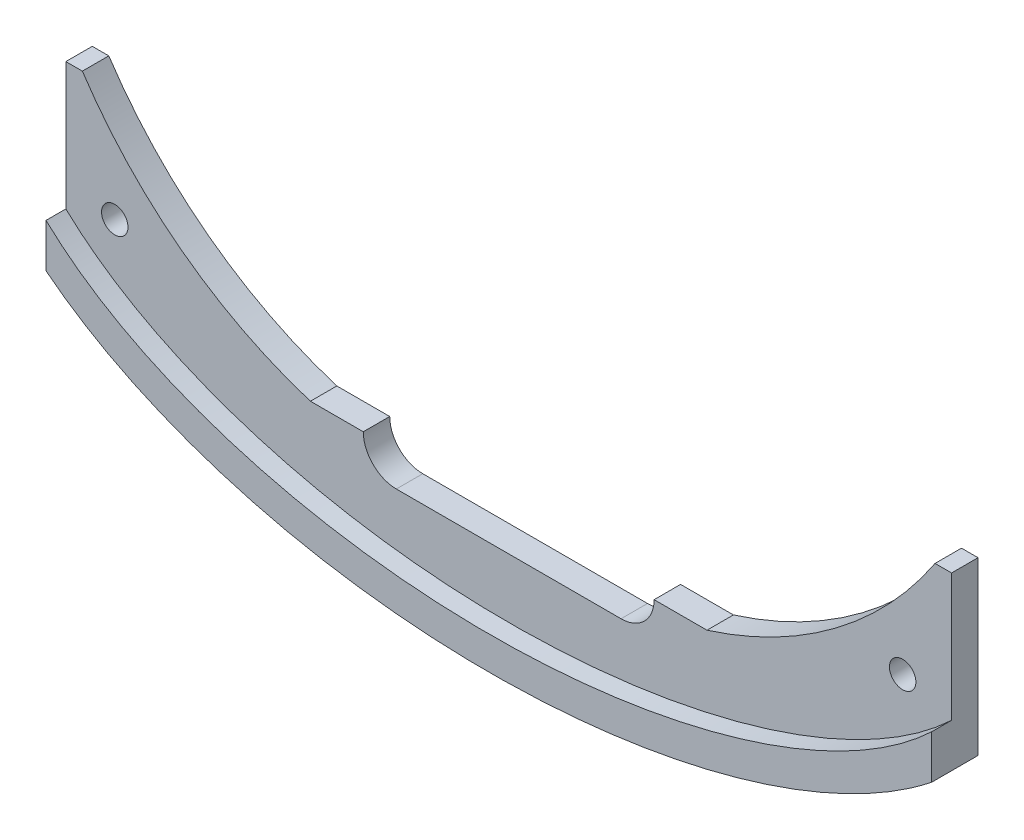
ISO-10303-21;
HEADER;
FILE_DESCRIPTION(('STEP AP214'),'2;1');
FILE_NAME('part.step','',(''),(''),'','','');
FILE_SCHEMA(('AUTOMOTIVE_DESIGN { 1 0 10303 214 1 1 1 1 }'));
ENDSEC;
DATA;
#1=APPLICATION_CONTEXT('core data for automotive mechanical design processes');
#2=APPLICATION_PROTOCOL_DEFINITION('international standard','automotive_design',2000,#1);
#3=PRODUCT_CONTEXT('',#1,'mechanical');
#4=PRODUCT('Part','Part','',(#3));
#5=PRODUCT_RELATED_PRODUCT_CATEGORY('part','',(#4));
#6=PRODUCT_DEFINITION_FORMATION('','',#4);
#7=PRODUCT_DEFINITION_CONTEXT('part definition',#1,'design');
#8=PRODUCT_DEFINITION('design','',#6,#7);
#9=PRODUCT_DEFINITION_SHAPE('','',#8);
#10=(LENGTH_UNIT() NAMED_UNIT(*) SI_UNIT(.MILLI.,.METRE.));
#11=(NAMED_UNIT(*) PLANE_ANGLE_UNIT() SI_UNIT($,.RADIAN.));
#12=(NAMED_UNIT(*) SI_UNIT($,.STERADIAN.) SOLID_ANGLE_UNIT());
#13=UNCERTAINTY_MEASURE_WITH_UNIT(LENGTH_MEASURE(1.E-05),#10,'distance_accuracy_value','');
#14=(GEOMETRIC_REPRESENTATION_CONTEXT(3) GLOBAL_UNCERTAINTY_ASSIGNED_CONTEXT((#13)) GLOBAL_UNIT_ASSIGNED_CONTEXT((#10,
#11,#12)) REPRESENTATION_CONTEXT('',''));
#15=CARTESIAN_POINT('',(0.,0.,0.));
#16=DIRECTION('',(0.,0.,1.));
#17=DIRECTION('',(1.,0.,0.));
#18=AXIS2_PLACEMENT_3D('',#15,#16,#17);
#19=CARTESIAN_POINT('',(30.,14.,-7.));
#20=DIRECTION('',(0.,-1.,0.));
#21=DIRECTION('',(1.,0.,0.));
#22=AXIS2_PLACEMENT_3D('',#19,#20,#21);
#23=PLANE('',#22);
#24=DIRECTION('',(1.,0.,0.));
#25=VECTOR('',#24,1.);
#26=CARTESIAN_POINT('',(30.,14.,-3.));
#27=LINE('',#26,#25);
#28=CARTESIAN_POINT('',(-30.,14.,-3.));
#29=VERTEX_POINT('',#28);
#30=CARTESIAN_POINT('',(-22.,14.,-3.));
#31=VERTEX_POINT('',#30);
#32=EDGE_CURVE('E151',#29,#31,#27,.T.);
#33=ORIENTED_EDGE('',*,*,#32,.T.);
#34=DIRECTION('',(0.,0.,-1.));
#35=VECTOR('',#34,1.);
#36=CARTESIAN_POINT('',(-22.,14.,-7.));
#37=LINE('',#36,#35);
#38=CARTESIAN_POINT('',(-22.,14.,-7.));
#39=VERTEX_POINT('',#38);
#40=EDGE_CURVE('E140',#31,#39,#37,.T.);
#41=ORIENTED_EDGE('',*,*,#40,.T.);
#42=DIRECTION('',(1.,0.,0.));
#43=VECTOR('',#42,1.);
#44=CARTESIAN_POINT('',(30.,14.,-7.));
#45=LINE('',#44,#43);
#46=CARTESIAN_POINT('',(-30.,14.,-7.));
#47=VERTEX_POINT('',#46);
#48=EDGE_CURVE('E149',#47,#39,#45,.T.);
#49=ORIENTED_EDGE('',*,*,#48,.F.);
#50=DIRECTION('',(0.,0.,1.));
#51=VECTOR('',#50,1.);
#52=CARTESIAN_POINT('',(-30.,14.,-7.));
#53=LINE('',#52,#51);
#54=EDGE_CURVE('E193',#47,#29,#53,.T.);
#55=ORIENTED_EDGE('',*,*,#54,.T.);
#56=EDGE_LOOP('',(#33,#41,#49,#55));
#57=FACE_BOUND('',#56,.T.);
#58=ADVANCED_FACE('F36',(#57),#23,.F.);
#59=CARTESIAN_POINT('',(0.,40.,-176.386654892759));
#60=DIRECTION('',(0.,0.,1.));
#61=DIRECTION('',(1.,0.,0.));
#62=AXIS2_PLACEMENT_3D('',#59,#60,#61);
#63=ELLIPSE('',#62,76.5,40.);
#64=DIRECTION('',(0.,0.,1.));
#65=VECTOR('',#64,1.);
#66=SURFACE_OF_LINEAR_EXTRUSION('',#63,#65);
#67=DIRECTION('',(0.,0.,1.));
#68=VECTOR('',#67,1.);
#69=CARTESIAN_POINT('',(67.,20.6942663870201,-1.50000000000008));
#70=LINE('',#69,#68);
#71=CARTESIAN_POINT('',(66.9999999999999,20.6942663870201,-3.00000000000009));
#72=VERTEX_POINT('',#71);
#73=CARTESIAN_POINT('',(66.9999999999999,20.6942663870201,0.));
#74=VERTEX_POINT('',#73);
#75=EDGE_CURVE('E304',#72,#74,#70,.T.);
#76=ORIENTED_EDGE('',*,*,#75,.F.);
#77=CARTESIAN_POINT('',(0.,40.,-3.));
#78=DIRECTION('',(0.,0.,-1.));
#79=DIRECTION('',(1.,0.,0.));
#80=AXIS2_PLACEMENT_3D('',#77,#78,#79);
#81=ELLIPSE('',#80,76.5,40.);
#82=CARTESIAN_POINT('',(-67.,20.6942663870201,-3.00000000000009));
#83=VERTEX_POINT('',#82);
#84=EDGE_CURVE('E180',#72,#83,#81,.T.);
#85=ORIENTED_EDGE('',*,*,#84,.T.);
#86=DIRECTION('',(0.,0.,1.));
#87=VECTOR('',#86,1.);
#88=CARTESIAN_POINT('',(-67.,20.6942663870201,-1.50000000000008));
#89=LINE('',#88,#87);
#90=CARTESIAN_POINT('',(-67.,20.6942663870201,0.));
#91=VERTEX_POINT('',#90);
#92=EDGE_CURVE('E293',#83,#91,#89,.T.);
#93=ORIENTED_EDGE('',*,*,#92,.T.);
#94=CARTESIAN_POINT('',(0.,40.,0.));
#95=DIRECTION('',(0.,0.,1.));
#96=DIRECTION('',(1.,0.,0.));
#97=AXIS2_PLACEMENT_3D('',#94,#95,#96);
#98=ELLIPSE('',#97,76.5,40.);
#99=EDGE_CURVE('E203',#91,#74,#98,.T.);
#100=ORIENTED_EDGE('',*,*,#99,.T.);
#101=EDGE_LOOP('',(#76,#85,#93,#100));
#102=FACE_BOUND('',#101,.T.);
#103=ADVANCED_FACE('F226',(#102),#66,.F.);
#104=CARTESIAN_POINT('',(64.5,40.,4.));
#105=DIRECTION('',(0.,-1.,0.));
#106=DIRECTION('',(0.,0.,-1.));
#107=AXIS2_PLACEMENT_3D('',#104,#105,#106);
#108=PLANE('',#107);
#109=DIRECTION('',(0.,0.,-1.));
#110=VECTOR('',#109,1.);
#111=CARTESIAN_POINT('',(67.,40.,3.));
#112=LINE('',#111,#110);
#113=CARTESIAN_POINT('',(67.,40.,-3.));
#114=VERTEX_POINT('',#113);
#115=CARTESIAN_POINT('',(67.,40.,-7.));
#116=VERTEX_POINT('',#115);
#117=EDGE_CURVE('E289',#114,#116,#112,.T.);
#118=ORIENTED_EDGE('',*,*,#117,.T.);
#119=DIRECTION('',(-1.,0.,0.));
#120=VECTOR('',#119,1.);
#121=CARTESIAN_POINT('',(81.5,40.,-7.00000000000001));
#122=LINE('',#121,#120);
#123=CARTESIAN_POINT('',(64.5,40.,-7.));
#124=VERTEX_POINT('',#123);
#125=EDGE_CURVE('E196',#116,#124,#122,.T.);
#126=ORIENTED_EDGE('',*,*,#125,.T.);
#127=DIRECTION('',(0.,0.,1.));
#128=VECTOR('',#127,1.);
#129=CARTESIAN_POINT('',(64.5,40.,-7.));
#130=LINE('',#129,#128);
#131=CARTESIAN_POINT('',(64.5,40.,-3.));
#132=VERTEX_POINT('',#131);
#133=EDGE_CURVE('E187',#124,#132,#130,.T.);
#134=ORIENTED_EDGE('',*,*,#133,.T.);
#135=DIRECTION('',(1.,0.,0.));
#136=VECTOR('',#135,1.);
#137=CARTESIAN_POINT('',(76.5,40.,-3.));
#138=LINE('',#137,#136);
#139=EDGE_CURVE('E177',#132,#114,#138,.T.);
#140=ORIENTED_EDGE('',*,*,#139,.T.);
#141=EDGE_LOOP('',(#118,#126,#134,#140));
#142=FACE_BOUND('',#141,.T.);
#143=ADVANCED_FACE('F229',(#142),#108,.F.);
#144=CARTESIAN_POINT('',(0.,40.,-7.));
#145=DIRECTION('',(0.,0.,-1.));
#146=DIRECTION('',(-1.,0.,0.));
#147=AXIS2_PLACEMENT_3D('',#144,#145,#146);
#148=PLANE('',#147);
#149=ORIENTED_EDGE('',*,*,#48,.T.);
#150=CARTESIAN_POINT('',(-17.,14.,-7.));
#151=DIRECTION('',(0.,0.,-1.));
#152=DIRECTION('',(-1.,0.,0.));
#153=AXIS2_PLACEMENT_3D('',#150,#151,#152);
#154=CIRCLE('',#153,5.);
#155=CARTESIAN_POINT('',(-17.,8.99999999999999,-7.));
#156=VERTEX_POINT('',#155);
#157=EDGE_CURVE('E136',#39,#156,#154,.F.);
#158=ORIENTED_EDGE('',*,*,#157,.T.);
#159=DIRECTION('',(-1.,0.,0.));
#160=VECTOR('',#159,1.);
#161=CARTESIAN_POINT('',(-22.,8.99999999999999,-7.));
#162=LINE('',#161,#160);
#163=CARTESIAN_POINT('',(17.,8.99999999999999,-7.));
#164=VERTEX_POINT('',#163);
#165=EDGE_CURVE('E280',#164,#156,#162,.T.);
#166=ORIENTED_EDGE('',*,*,#165,.F.);
#167=CARTESIAN_POINT('',(17.,14.,-7.));
#168=DIRECTION('',(0.,0.,-1.));
#169=DIRECTION('',(-1.,0.,0.));
#170=AXIS2_PLACEMENT_3D('',#167,#168,#169);
#171=CIRCLE('',#170,5.);
#172=CARTESIAN_POINT('',(22.,14.,-7.));
#173=VERTEX_POINT('',#172);
#174=EDGE_CURVE('E44',#164,#173,#171,.F.);
#175=ORIENTED_EDGE('',*,*,#174,.T.);
#176=CARTESIAN_POINT('',(30.,14.,-7.));
#177=VERTEX_POINT('',#176);
#178=EDGE_CURVE('E161',#173,#177,#45,.T.);
#179=ORIENTED_EDGE('',*,*,#178,.T.);
#180=CARTESIAN_POINT('',(10.6544644361917,75.5594606519764,-7.));
#181=DIRECTION('',(0.,0.,1.));
#182=DIRECTION('',(-1.,0.,0.));
#183=AXIS2_PLACEMENT_3D('',#180,#181,#182);
#184=CIRCLE('',#183,64.5276447889802);
#185=EDGE_CURVE('E160',#177,#124,#184,.T.);
#186=ORIENTED_EDGE('',*,*,#185,.T.);
#187=ORIENTED_EDGE('',*,*,#125,.F.);
#188=DIRECTION('',(0.,-1.,0.));
#189=VECTOR('',#188,1.);
#190=CARTESIAN_POINT('',(66.9999999999999,-1.43485789073709E-13,-7.));
#191=LINE('',#190,#189);
#192=CARTESIAN_POINT('',(67.0000000040633,14.0793345739256,-7.));
#193=VERTEX_POINT('',#192);
#194=EDGE_CURVE('E286',#116,#193,#191,.T.);
#195=ORIENTED_EDGE('',*,*,#194,.T.);
#196=CARTESIAN_POINT('',(-81.5,40.,-7.00000000000006));
#197=CARTESIAN_POINT('',(-81.5,36.7505295268644,-7.00000000000006));
#198=CARTESIAN_POINT('',(-80.2609957361757,30.2809682014024,-7.00000000000006));
#199=CARTESIAN_POINT('',(-73.3217409081439,18.4427697279927,-7.00000000000006));
#200=CARTESIAN_POINT('',(-57.7397657128275,6.42877793137961,-7.00000000000006));
#201=CARTESIAN_POINT('',(-31.0655415341109,-2.85144915391041,-7.00000000000006));
#202=CARTESIAN_POINT('',(0.,-6.07427542304479,-7.00000000000006));
#203=CARTESIAN_POINT('',(31.0655415341109,-2.85144915391042,-7.00000000000006));
#204=CARTESIAN_POINT('',(57.7397657128275,6.42877793137959,-7.00000000000006));
#205=CARTESIAN_POINT('',(73.3217409081439,18.4427697279927,-7.00000000000006));
#206=CARTESIAN_POINT('',(80.2609957361757,30.2809682014024,-7.00000000000006));
#207=CARTESIAN_POINT('',(81.5,36.7505295268644,-7.00000000000006));
#208=CARTESIAN_POINT('',(81.5,40.,-7.00000000000006));
#209=B_SPLINE_CURVE_WITH_KNOTS('',3,(#196,#197,#198,#199,#200,#201,#202,#203,#204,#205,#206,
#207,#208),.UNSPECIFIED.,.F.,.F.,(4,1,1,1,1,1,1,1,1,1,4),(3.14159265358979,3.33794219443916,
3.53429173528852,3.92699081698724,4.31968989868597,4.71238898038469,5.10508806208341,
5.49778714378214,5.89048622548086,6.08683576633022,6.28318530717959),.UNSPECIFIED.);
#210=CARTESIAN_POINT('',(-67.0000000006021,14.0793345711775,-7.));
#211=VERTEX_POINT('',#210);
#212=EDGE_CURVE('E198',#211,#193,#209,.T.);
#213=ORIENTED_EDGE('',*,*,#212,.F.);
#214=DIRECTION('',(0.,-1.,0.));
#215=VECTOR('',#214,1.);
#216=CARTESIAN_POINT('',(-67.,0.,-7.));
#217=LINE('',#216,#215);
#218=CARTESIAN_POINT('',(-67.,40.,-7.));
#219=VERTEX_POINT('',#218);
#220=EDGE_CURVE('E281',#219,#211,#217,.T.);
#221=ORIENTED_EDGE('',*,*,#220,.F.);
#222=DIRECTION('',(1.,0.,0.));
#223=VECTOR('',#222,1.);
#224=CARTESIAN_POINT('',(-81.5,40.,-7.00000000000001));
#225=LINE('',#224,#223);
#226=CARTESIAN_POINT('',(-64.5,40.,-7.));
#227=VERTEX_POINT('',#226);
#228=EDGE_CURVE('E195',#219,#227,#225,.T.);
#229=ORIENTED_EDGE('',*,*,#228,.T.);
#230=CARTESIAN_POINT('',(-10.6544644361917,75.5594606519764,-7.));
#231=DIRECTION('',(0.,0.,1.));
#232=DIRECTION('',(-1.,0.,0.));
#233=AXIS2_PLACEMENT_3D('',#230,#231,#232);
#234=CIRCLE('',#233,64.5276447889802);
#235=EDGE_CURVE('E158',#227,#47,#234,.T.);
#236=ORIENTED_EDGE('',*,*,#235,.T.);
#237=EDGE_LOOP('',(#149,#158,#166,#175,#179,#186,#187,#195,#213,#221,#229,#236));
#238=FACE_BOUND('',#237,.T.);
#239=CARTESIAN_POINT('',(59.6,23.,-7.));
#240=DIRECTION('',(0.,0.,-1.));
#241=DIRECTION('',(-1.,0.,0.));
#242=AXIS2_PLACEMENT_3D('',#239,#240,#241);
#243=CIRCLE('',#242,2.);
#244=CARTESIAN_POINT('',(57.6,23.,-7.));
#245=VERTEX_POINT('',#244);
#246=EDGE_CURVE('E173',#245,#245,#243,.T.);
#247=ORIENTED_EDGE('',*,*,#246,.F.);
#248=EDGE_LOOP('',(#247));
#249=FACE_BOUND('',#248,.T.);
#250=CARTESIAN_POINT('',(-59.6,23.,-7.));
#251=DIRECTION('',(0.,0.,-1.));
#252=DIRECTION('',(-1.,0.,0.));
#253=AXIS2_PLACEMENT_3D('',#250,#251,#252);
#254=CIRCLE('',#253,2.);
#255=CARTESIAN_POINT('',(-61.6,23.,-7.));
#256=VERTEX_POINT('',#255);
#257=EDGE_CURVE('E309',#256,#256,#254,.T.);
#258=ORIENTED_EDGE('',*,*,#257,.F.);
#259=EDGE_LOOP('',(#258));
#260=FACE_BOUND('',#259,.T.);
#261=ADVANCED_FACE('F155',(#238,#249,#260),#148,.T.);
#262=CARTESIAN_POINT('',(-81.5,40.,-176.386654892759));
#263=CARTESIAN_POINT('',(-81.5,36.7505295268644,-176.386654892759));
#264=CARTESIAN_POINT('',(-80.2609957361757,30.2809682014024,-176.386654892759));
#265=CARTESIAN_POINT('',(-73.3217409081439,18.4427697279927,-176.386654892759));
#266=CARTESIAN_POINT('',(-57.7397657128275,6.42877793137961,-176.386654892759));
#267=CARTESIAN_POINT('',(-31.0655415341109,-2.85144915391041,-176.386654892759));
#268=CARTESIAN_POINT('',(0.,-6.07427542304479,-176.386654892759));
#269=CARTESIAN_POINT('',(31.0655415341109,-2.85144915391042,-176.386654892759));
#270=CARTESIAN_POINT('',(57.7397657128275,6.42877793137959,-176.386654892759));
#271=CARTESIAN_POINT('',(73.3217409081439,18.4427697279927,-176.386654892759));
#272=CARTESIAN_POINT('',(80.2609957361757,30.2809682014024,-176.386654892759));
#273=CARTESIAN_POINT('',(81.5,36.7505295268644,-176.386654892759));
#274=CARTESIAN_POINT('',(81.5,40.,-176.386654892759));
#275=B_SPLINE_CURVE_WITH_KNOTS('',3,(#262,#263,#264,#265,#266,#267,#268,#269,#270,#271,#272,
#273,#274),.UNSPECIFIED.,.F.,.F.,(4,1,1,1,1,1,1,1,1,1,4),(3.14159265358979,3.33794219443916,
3.53429173528852,3.92699081698724,4.31968989868597,4.71238898038469,5.10508806208341,
5.49778714378214,5.89048622548086,6.08683576633022,6.28318530717959),.UNSPECIFIED.);
#276=DIRECTION('',(0.,0.,1.));
#277=VECTOR('',#276,1.);
#278=SURFACE_OF_LINEAR_EXTRUSION('',#275,#277);
#279=ORIENTED_EDGE('',*,*,#212,.T.);
#280=DIRECTION('',(0.,0.,-1.));
#281=VECTOR('',#280,1.);
#282=CARTESIAN_POINT('',(67.0000000040633,14.0793345739256,3.));
#283=LINE('',#282,#281);
#284=CARTESIAN_POINT('',(67.0000000040633,14.0793345739256,0.));
#285=VERTEX_POINT('',#284);
#286=EDGE_CURVE('E291',#285,#193,#283,.T.);
#287=ORIENTED_EDGE('',*,*,#286,.F.);
#288=CARTESIAN_POINT('',(-81.5,40.,0.));
#289=CARTESIAN_POINT('',(-81.5,36.7505295268644,0.));
#290=CARTESIAN_POINT('',(-80.2609957361757,30.2809682014024,0.));
#291=CARTESIAN_POINT('',(-73.3217409081439,18.4427697279927,0.));
#292=CARTESIAN_POINT('',(-57.7397657128275,6.42877793137961,0.));
#293=CARTESIAN_POINT('',(-31.0655415341109,-2.85144915391041,0.));
#294=CARTESIAN_POINT('',(0.,-6.07427542304479,0.));
#295=CARTESIAN_POINT('',(31.0655415341109,-2.85144915391042,0.));
#296=CARTESIAN_POINT('',(57.7397657128275,6.42877793137959,0.));
#297=CARTESIAN_POINT('',(73.3217409081439,18.4427697279927,0.));
#298=CARTESIAN_POINT('',(80.2609957361757,30.2809682014024,0.));
#299=CARTESIAN_POINT('',(81.5,36.7505295268644,0.));
#300=CARTESIAN_POINT('',(81.5,40.,0.));
#301=B_SPLINE_CURVE_WITH_KNOTS('',3,(#288,#289,#290,#291,#292,#293,#294,#295,#296,#297,#298,
#299,#300),.UNSPECIFIED.,.F.,.F.,(4,1,1,1,1,1,1,1,1,1,4),(3.14159265358979,3.33794219443916,
3.53429173528852,3.92699081698724,4.31968989868597,4.71238898038469,5.10508806208341,
5.49778714378214,5.89048622548086,6.08683576633022,6.28318530717959),.UNSPECIFIED.);
#302=CARTESIAN_POINT('',(-67.0000000040635,14.0793345739257,0.));
#303=VERTEX_POINT('',#302);
#304=EDGE_CURVE('E368',#303,#285,#301,.T.);
#305=ORIENTED_EDGE('',*,*,#304,.F.);
#306=DIRECTION('',(0.,0.,-1.));
#307=VECTOR('',#306,1.);
#308=CARTESIAN_POINT('',(-67.0000000006021,14.0793345711775,3.));
#309=LINE('',#308,#307);
#310=EDGE_CURVE('E290',#303,#211,#309,.T.);
#311=ORIENTED_EDGE('',*,*,#310,.T.);
#312=EDGE_LOOP('',(#279,#287,#305,#311));
#313=FACE_BOUND('',#312,.T.);
#314=ADVANCED_FACE('F218',(#313),#278,.T.);
#315=CARTESIAN_POINT('',(0.,40.,-3.));
#316=DIRECTION('',(0.,0.,-1.));
#317=DIRECTION('',(-1.,0.,0.));
#318=AXIS2_PLACEMENT_3D('',#315,#316,#317);
#319=PLANE('',#318);
#320=CARTESIAN_POINT('',(-59.6,23.,-3.));
#321=DIRECTION('',(0.,0.,-1.));
#322=DIRECTION('',(-1.,0.,0.));
#323=AXIS2_PLACEMENT_3D('',#320,#321,#322);
#324=CIRCLE('',#323,2.);
#325=CARTESIAN_POINT('',(-61.6,23.,-3.));
#326=VERTEX_POINT('',#325);
#327=EDGE_CURVE('E308',#326,#326,#324,.T.);
#328=ORIENTED_EDGE('',*,*,#327,.T.);
#329=EDGE_LOOP('',(#328));
#330=FACE_BOUND('',#329,.T.);
#331=CARTESIAN_POINT('',(59.6,23.,-3.));
#332=DIRECTION('',(0.,0.,-1.));
#333=DIRECTION('',(-1.,0.,0.));
#334=AXIS2_PLACEMENT_3D('',#331,#332,#333);
#335=CIRCLE('',#334,2.);
#336=CARTESIAN_POINT('',(57.6,23.,-3.));
#337=VERTEX_POINT('',#336);
#338=EDGE_CURVE('E312',#337,#337,#335,.T.);
#339=ORIENTED_EDGE('',*,*,#338,.T.);
#340=EDGE_LOOP('',(#339));
#341=FACE_BOUND('',#340,.T.);
#342=CARTESIAN_POINT('',(22.,14.,-3.));
#343=VERTEX_POINT('',#342);
#344=CARTESIAN_POINT('',(30.,14.,-3.));
#345=VERTEX_POINT('',#344);
#346=EDGE_CURVE('E172',#343,#345,#27,.T.);
#347=ORIENTED_EDGE('',*,*,#346,.F.);
#348=CARTESIAN_POINT('',(17.,14.,-3.));
#349=DIRECTION('',(0.,0.,-1.));
#350=DIRECTION('',(-1.,0.,0.));
#351=AXIS2_PLACEMENT_3D('',#348,#349,#350);
#352=CIRCLE('',#351,5.);
#353=CARTESIAN_POINT('',(17.,8.99999999999999,-3.));
#354=VERTEX_POINT('',#353);
#355=EDGE_CURVE('E11',#343,#354,#352,.T.);
#356=ORIENTED_EDGE('',*,*,#355,.T.);
#357=DIRECTION('',(-1.,0.,0.));
#358=VECTOR('',#357,1.);
#359=CARTESIAN_POINT('',(0.,8.99999999999999,-3.));
#360=LINE('',#359,#358);
#361=CARTESIAN_POINT('',(-17.,8.99999999999999,-3.));
#362=VERTEX_POINT('',#361);
#363=EDGE_CURVE('E152',#354,#362,#360,.T.);
#364=ORIENTED_EDGE('',*,*,#363,.T.);
#365=CARTESIAN_POINT('',(-17.,14.,-3.));
#366=DIRECTION('',(0.,0.,-1.));
#367=DIRECTION('',(-1.,0.,0.));
#368=AXIS2_PLACEMENT_3D('',#365,#366,#367);
#369=CIRCLE('',#368,5.);
#370=EDGE_CURVE('E144',#362,#31,#369,.T.);
#371=ORIENTED_EDGE('',*,*,#370,.T.);
#372=ORIENTED_EDGE('',*,*,#32,.F.);
#373=CARTESIAN_POINT('',(-10.6544644361917,75.5594606519764,-3.));
#374=DIRECTION('',(0.,0.,1.));
#375=DIRECTION('',(-1.,0.,0.));
#376=AXIS2_PLACEMENT_3D('',#373,#374,#375);
#377=CIRCLE('',#376,64.5276447889802);
#378=CARTESIAN_POINT('',(-64.5,40.,-3.));
#379=VERTEX_POINT('',#378);
#380=EDGE_CURVE('E169',#379,#29,#377,.T.);
#381=ORIENTED_EDGE('',*,*,#380,.F.);
#382=DIRECTION('',(1.,0.,0.));
#383=VECTOR('',#382,1.);
#384=CARTESIAN_POINT('',(-64.5,40.,-3.));
#385=LINE('',#384,#383);
#386=CARTESIAN_POINT('',(-67.,40.,-3.));
#387=VERTEX_POINT('',#386);
#388=EDGE_CURVE('E183',#387,#379,#385,.T.);
#389=ORIENTED_EDGE('',*,*,#388,.F.);
#390=DIRECTION('',(0.,-1.,0.));
#391=VECTOR('',#390,1.);
#392=CARTESIAN_POINT('',(-67.,39.9999999999999,-3.));
#393=LINE('',#392,#391);
#394=EDGE_CURVE('E301',#387,#83,#393,.T.);
#395=ORIENTED_EDGE('',*,*,#394,.T.);
#396=ORIENTED_EDGE('',*,*,#84,.F.);
#397=DIRECTION('',(0.,-1.,0.));
#398=VECTOR('',#397,1.);
#399=CARTESIAN_POINT('',(67.,39.9999999999999,-3.));
#400=LINE('',#399,#398);
#401=EDGE_CURVE('E306',#114,#72,#400,.T.);
#402=ORIENTED_EDGE('',*,*,#401,.F.);
#403=ORIENTED_EDGE('',*,*,#139,.F.);
#404=CARTESIAN_POINT('',(10.6544644361917,75.5594606519764,-3.));
#405=DIRECTION('',(0.,0.,1.));
#406=DIRECTION('',(-1.,0.,0.));
#407=AXIS2_PLACEMENT_3D('',#404,#405,#406);
#408=CIRCLE('',#407,64.5276447889802);
#409=EDGE_CURVE('E175',#345,#132,#408,.T.);
#410=ORIENTED_EDGE('',*,*,#409,.F.);
#411=EDGE_LOOP('',(#347,#356,#364,#371,#372,#381,#389,#395,#396,#402,#403,#410));
#412=FACE_BOUND('',#411,.T.);
#413=ADVANCED_FACE('F222',(#330,#341,#412),#319,.F.);
#414=CARTESIAN_POINT('',(-81.5,40.,0.));
#415=DIRECTION('',(0.,0.,-1.));
#416=DIRECTION('',(-1.,0.,0.));
#417=AXIS2_PLACEMENT_3D('',#414,#415,#416);
#418=PLANE('',#417);
#419=DIRECTION('',(0.,-1.,0.));
#420=VECTOR('',#419,1.);
#421=CARTESIAN_POINT('',(67.,39.9999999999997,0.));
#422=LINE('',#421,#420);
#423=EDGE_CURVE('E270',#74,#285,#422,.T.);
#424=ORIENTED_EDGE('',*,*,#423,.F.);
#425=ORIENTED_EDGE('',*,*,#99,.F.);
#426=DIRECTION('',(0.,-1.,0.));
#427=VECTOR('',#426,1.);
#428=CARTESIAN_POINT('',(-67.,40.,0.));
#429=LINE('',#428,#427);
#430=EDGE_CURVE('E272',#91,#303,#429,.T.);
#431=ORIENTED_EDGE('',*,*,#430,.T.);
#432=ORIENTED_EDGE('',*,*,#304,.T.);
#433=EDGE_LOOP('',(#424,#425,#431,#432));
#434=FACE_BOUND('',#433,.T.);
#435=ADVANCED_FACE('F236',(#434),#418,.F.);
#436=CARTESIAN_POINT('',(-76.5,40.,4.));
#437=DIRECTION('',(0.,-1.,0.));
#438=DIRECTION('',(0.,0.,-1.));
#439=AXIS2_PLACEMENT_3D('',#436,#437,#438);
#440=PLANE('',#439);
#441=ORIENTED_EDGE('',*,*,#228,.F.);
#442=DIRECTION('',(0.,0.,-1.));
#443=VECTOR('',#442,1.);
#444=CARTESIAN_POINT('',(-67.,40.,3.));
#445=LINE('',#444,#443);
#446=EDGE_CURVE('E283',#387,#219,#445,.T.);
#447=ORIENTED_EDGE('',*,*,#446,.F.);
#448=ORIENTED_EDGE('',*,*,#388,.T.);
#449=DIRECTION('',(0.,0.,1.));
#450=VECTOR('',#449,1.);
#451=CARTESIAN_POINT('',(-64.5,40.,-7.));
#452=LINE('',#451,#450);
#453=EDGE_CURVE('E164',#227,#379,#452,.T.);
#454=ORIENTED_EDGE('',*,*,#453,.F.);
#455=EDGE_LOOP('',(#441,#447,#448,#454));
#456=FACE_BOUND('',#455,.T.);
#457=ADVANCED_FACE('F233',(#456),#440,.F.);
#458=CARTESIAN_POINT('',(-10.6544644361917,75.5594606519764,-7.));
#459=DIRECTION('',(0.,0.,1.));
#460=DIRECTION('',(1.,0.,0.));
#461=AXIS2_PLACEMENT_3D('',#458,#459,#460);
#462=CYLINDRICAL_SURFACE('',#461,64.5276447889802);
#463=ORIENTED_EDGE('',*,*,#380,.T.);
#464=ORIENTED_EDGE('',*,*,#54,.F.);
#465=ORIENTED_EDGE('',*,*,#235,.F.);
#466=ORIENTED_EDGE('',*,*,#453,.T.);
#467=EDGE_LOOP('',(#463,#464,#465,#466));
#468=FACE_BOUND('',#467,.T.);
#469=ADVANCED_FACE('F224',(#468),#462,.F.);
#470=ORIENTED_EDGE('',*,*,#178,.F.);
#471=DIRECTION('',(0.,0.,1.));
#472=VECTOR('',#471,1.);
#473=CARTESIAN_POINT('',(22.,14.,-7.));
#474=LINE('',#473,#472);
#475=EDGE_CURVE('E153',#173,#343,#474,.T.);
#476=ORIENTED_EDGE('',*,*,#475,.T.);
#477=ORIENTED_EDGE('',*,*,#346,.T.);
#478=DIRECTION('',(0.,0.,1.));
#479=VECTOR('',#478,1.);
#480=CARTESIAN_POINT('',(30.,14.,-7.));
#481=LINE('',#480,#479);
#482=EDGE_CURVE('E190',#177,#345,#481,.T.);
#483=ORIENTED_EDGE('',*,*,#482,.F.);
#484=EDGE_LOOP('',(#470,#476,#477,#483));
#485=FACE_BOUND('',#484,.T.);
#486=ADVANCED_FACE('F250',(#485),#23,.F.);
#487=CARTESIAN_POINT('',(10.6544644361917,75.5594606519764,-7.));
#488=DIRECTION('',(0.,0.,1.));
#489=DIRECTION('',(1.,0.,0.));
#490=AXIS2_PLACEMENT_3D('',#487,#488,#489);
#491=CYLINDRICAL_SURFACE('',#490,64.5276447889802);
#492=ORIENTED_EDGE('',*,*,#409,.T.);
#493=ORIENTED_EDGE('',*,*,#133,.F.);
#494=ORIENTED_EDGE('',*,*,#185,.F.);
#495=ORIENTED_EDGE('',*,*,#482,.T.);
#496=EDGE_LOOP('',(#492,#493,#494,#495));
#497=FACE_BOUND('',#496,.T.);
#498=ADVANCED_FACE('F255',(#497),#491,.F.);
#499=CARTESIAN_POINT('',(59.6,23.,-7.));
#500=DIRECTION('',(0.,0.,1.));
#501=DIRECTION('',(1.,0.,0.));
#502=AXIS2_PLACEMENT_3D('',#499,#500,#501);
#503=CYLINDRICAL_SURFACE('',#502,2.);
#504=ORIENTED_EDGE('',*,*,#246,.T.);
#505=EDGE_LOOP('',(#504));
#506=FACE_BOUND('',#505,.T.);
#507=ORIENTED_EDGE('',*,*,#338,.F.);
#508=EDGE_LOOP('',(#507));
#509=FACE_BOUND('',#508,.T.);
#510=ADVANCED_FACE('F261',(#506,#509),#503,.F.);
#511=CARTESIAN_POINT('',(-59.6,23.,-7.));
#512=DIRECTION('',(0.,0.,1.));
#513=DIRECTION('',(1.,0.,0.));
#514=AXIS2_PLACEMENT_3D('',#511,#512,#513);
#515=CYLINDRICAL_SURFACE('',#514,2.);
#516=ORIENTED_EDGE('',*,*,#257,.T.);
#517=EDGE_LOOP('',(#516));
#518=FACE_BOUND('',#517,.T.);
#519=ORIENTED_EDGE('',*,*,#327,.F.);
#520=EDGE_LOOP('',(#519));
#521=FACE_BOUND('',#520,.T.);
#522=ADVANCED_FACE('F321',(#518,#521),#515,.F.);
#523=CARTESIAN_POINT('',(-67.,0.,3.));
#524=DIRECTION('',(1.,0.,0.));
#525=DIRECTION('',(0.,1.,0.));
#526=AXIS2_PLACEMENT_3D('',#523,#524,#525);
#527=PLANE('',#526);
#528=ORIENTED_EDGE('',*,*,#446,.T.);
#529=ORIENTED_EDGE('',*,*,#220,.T.);
#530=ORIENTED_EDGE('',*,*,#310,.F.);
#531=ORIENTED_EDGE('',*,*,#430,.F.);
#532=ORIENTED_EDGE('',*,*,#92,.F.);
#533=ORIENTED_EDGE('',*,*,#394,.F.);
#534=EDGE_LOOP('',(#528,#529,#530,#531,#532,#533));
#535=FACE_BOUND('',#534,.T.);
#536=ADVANCED_FACE('F327',(#535),#527,.F.);
#537=CARTESIAN_POINT('',(66.9999999999999,-1.43485789073709E-13,3.));
#538=DIRECTION('',(1.,0.,0.));
#539=DIRECTION('',(0.,1.,0.));
#540=AXIS2_PLACEMENT_3D('',#537,#538,#539);
#541=PLANE('',#540);
#542=ORIENTED_EDGE('',*,*,#401,.T.);
#543=ORIENTED_EDGE('',*,*,#75,.T.);
#544=ORIENTED_EDGE('',*,*,#423,.T.);
#545=ORIENTED_EDGE('',*,*,#286,.T.);
#546=ORIENTED_EDGE('',*,*,#194,.F.);
#547=ORIENTED_EDGE('',*,*,#117,.F.);
#548=EDGE_LOOP('',(#542,#543,#544,#545,#546,#547));
#549=FACE_BOUND('',#548,.T.);
#550=ADVANCED_FACE('F247',(#549),#541,.T.);
#551=CARTESIAN_POINT('',(-22.,8.99999999999999,3.));
#552=DIRECTION('',(0.,-1.,0.));
#553=DIRECTION('',(1.,0.,0.));
#554=AXIS2_PLACEMENT_3D('',#551,#552,#553);
#555=PLANE('',#554);
#556=ORIENTED_EDGE('',*,*,#165,.T.);
#557=DIRECTION('',(0.,0.,-1.));
#558=VECTOR('',#557,1.);
#559=CARTESIAN_POINT('',(-17.,8.99999999999999,-3.));
#560=LINE('',#559,#558);
#561=EDGE_CURVE('E51',#156,#362,#560,.F.);
#562=ORIENTED_EDGE('',*,*,#561,.T.);
#563=ORIENTED_EDGE('',*,*,#363,.F.);
#564=DIRECTION('',(0.,0.,-1.));
#565=VECTOR('',#564,1.);
#566=CARTESIAN_POINT('',(17.,8.99999999999999,-7.));
#567=LINE('',#566,#565);
#568=EDGE_CURVE('E277',#354,#164,#567,.T.);
#569=ORIENTED_EDGE('',*,*,#568,.T.);
#570=EDGE_LOOP('',(#556,#562,#563,#569));
#571=FACE_BOUND('',#570,.T.);
#572=ADVANCED_FACE('F241',(#571),#555,.F.);
#573=CARTESIAN_POINT('',(-17.,14.,3.));
#574=DIRECTION('',(0.,0.,1.));
#575=DIRECTION('',(1.,0.,0.));
#576=AXIS2_PLACEMENT_3D('',#573,#574,#575);
#577=CYLINDRICAL_SURFACE('',#576,5.);
#578=ORIENTED_EDGE('',*,*,#370,.F.);
#579=ORIENTED_EDGE('',*,*,#561,.F.);
#580=ORIENTED_EDGE('',*,*,#157,.F.);
#581=ORIENTED_EDGE('',*,*,#40,.F.);
#582=EDGE_LOOP('',(#578,#579,#580,#581));
#583=FACE_BOUND('',#582,.T.);
#584=ADVANCED_FACE('F139',(#583),#577,.F.);
#585=CARTESIAN_POINT('',(17.,14.,3.));
#586=DIRECTION('',(0.,0.,1.));
#587=DIRECTION('',(1.,0.,0.));
#588=AXIS2_PLACEMENT_3D('',#585,#586,#587);
#589=CYLINDRICAL_SURFACE('',#588,5.);
#590=ORIENTED_EDGE('',*,*,#355,.F.);
#591=ORIENTED_EDGE('',*,*,#475,.F.);
#592=ORIENTED_EDGE('',*,*,#174,.F.);
#593=ORIENTED_EDGE('',*,*,#568,.F.);
#594=EDGE_LOOP('',(#590,#591,#592,#593));
#595=FACE_BOUND('',#594,.T.);
#596=ADVANCED_FACE('F38',(#595),#589,.F.);
#597=CLOSED_SHELL('',(#58,#103,#143,#261,#314,#413,#435,#457,#469,#486,#498,#510,#522,#536,#550,
#572,#584,#596));
#598=MANIFOLD_SOLID_BREP('B2',#597);
#599=ADVANCED_BREP_SHAPE_REPRESENTATION('',(#18,#598),#14);
#600=SHAPE_DEFINITION_REPRESENTATION(#9,#599);
ENDSEC;
END-ISO-10303-21;
